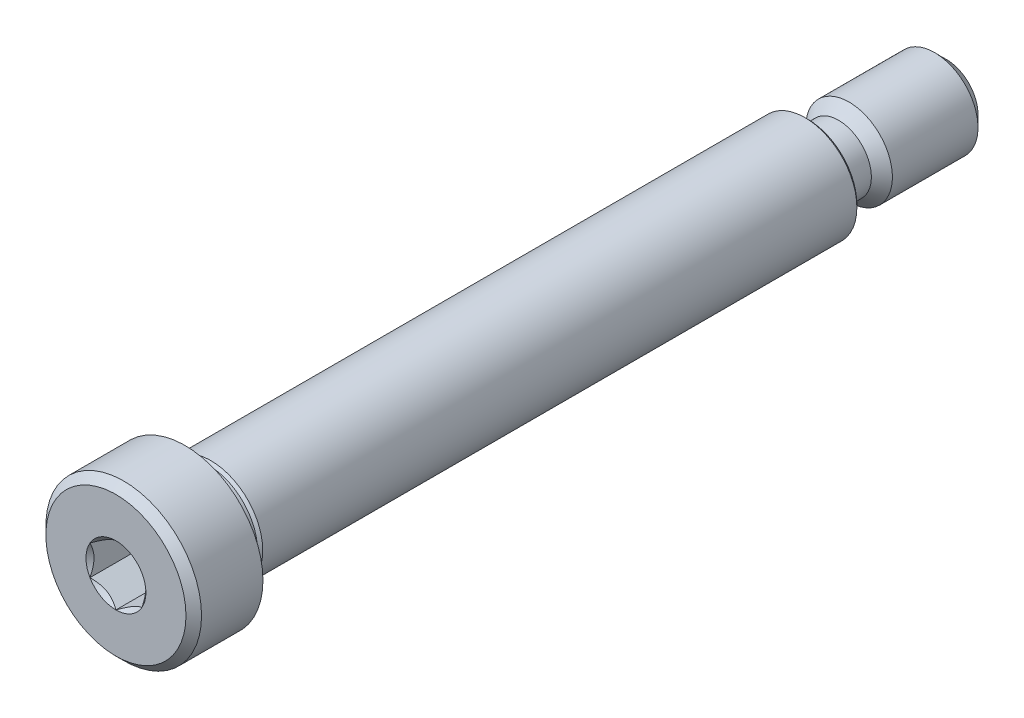
ISO-10303-21;
HEADER;
FILE_DESCRIPTION(('STEP AP214'),'2;1');
FILE_NAME('part.step','',(''),(''),'','','');
FILE_SCHEMA(('AUTOMOTIVE_DESIGN { 1 0 10303 214 1 1 1 1 }'));
ENDSEC;
DATA;
#1=APPLICATION_CONTEXT('core data for automotive mechanical design processes');
#2=APPLICATION_PROTOCOL_DEFINITION('international standard','automotive_design',2000,#1);
#3=PRODUCT_CONTEXT('',#1,'mechanical');
#4=PRODUCT('Part','Part','',(#3));
#5=PRODUCT_RELATED_PRODUCT_CATEGORY('part','',(#4));
#6=PRODUCT_DEFINITION_FORMATION('','',#4);
#7=PRODUCT_DEFINITION_CONTEXT('part definition',#1,'design');
#8=PRODUCT_DEFINITION('design','',#6,#7);
#9=PRODUCT_DEFINITION_SHAPE('','',#8);
#10=(LENGTH_UNIT() NAMED_UNIT(*) SI_UNIT(.MILLI.,.METRE.));
#11=(NAMED_UNIT(*) PLANE_ANGLE_UNIT() SI_UNIT($,.RADIAN.));
#12=(NAMED_UNIT(*) SI_UNIT($,.STERADIAN.) SOLID_ANGLE_UNIT());
#13=UNCERTAINTY_MEASURE_WITH_UNIT(LENGTH_MEASURE(1.E-05),#10,'distance_accuracy_value','');
#14=(GEOMETRIC_REPRESENTATION_CONTEXT(3) GLOBAL_UNCERTAINTY_ASSIGNED_CONTEXT((#13)) GLOBAL_UNIT_ASSIGNED_CONTEXT((#10,
#11,#12)) REPRESENTATION_CONTEXT('',''));
#15=CARTESIAN_POINT('',(0.,0.,0.));
#16=DIRECTION('',(0.,0.,1.));
#17=DIRECTION('',(1.,0.,0.));
#18=AXIS2_PLACEMENT_3D('',#15,#16,#17);
#19=CARTESIAN_POINT('',(0.,6.429375,38.1));
#20=DIRECTION('',(0.,0.,-1.));
#21=DIRECTION('',(-1.,0.,0.));
#22=AXIS2_PLACEMENT_3D('',#19,#20,#21);
#23=PLANE('',#22);
#24=CARTESIAN_POINT('',(0.,0.,38.1));
#25=DIRECTION('',(0.,0.,1.));
#26=DIRECTION('',(1.,0.,0.));
#27=AXIS2_PLACEMENT_3D('',#24,#25,#26);
#28=CIRCLE('',#27,2.74963065701559);
#29=CARTESIAN_POINT('',(-2.38125,1.3748153285078,38.1));
#30=VERTEX_POINT('',#29);
#31=CARTESIAN_POINT('',(-2.38125,-1.3748153285078,38.1));
#32=VERTEX_POINT('',#31);
#33=EDGE_CURVE('E135',#30,#32,#28,.T.);
#34=ORIENTED_EDGE('',*,*,#33,.F.);
#35=CARTESIAN_POINT('',(0.,2.74963065701559,38.1));
#36=VERTEX_POINT('',#35);
#37=EDGE_CURVE('E130',#36,#30,#28,.T.);
#38=ORIENTED_EDGE('',*,*,#37,.F.);
#39=CARTESIAN_POINT('',(2.38125,1.3748153285078,38.1));
#40=VERTEX_POINT('',#39);
#41=EDGE_CURVE('E102',#40,#36,#28,.T.);
#42=ORIENTED_EDGE('',*,*,#41,.F.);
#43=CARTESIAN_POINT('',(2.38125,-1.3748153285078,38.1));
#44=VERTEX_POINT('',#43);
#45=EDGE_CURVE('E92',#44,#40,#28,.T.);
#46=ORIENTED_EDGE('',*,*,#45,.F.);
#47=CARTESIAN_POINT('',(0.,-2.74963065701559,38.1));
#48=VERTEX_POINT('',#47);
#49=EDGE_CURVE('E53',#48,#44,#28,.T.);
#50=ORIENTED_EDGE('',*,*,#49,.F.);
#51=EDGE_CURVE('E60',#32,#48,#28,.T.);
#52=ORIENTED_EDGE('',*,*,#51,.F.);
#53=EDGE_LOOP('',(#34,#38,#42,#46,#50,#52));
#54=FACE_BOUND('',#53,.T.);
#55=CARTESIAN_POINT('',(0.,0.,38.1));
#56=DIRECTION('',(0.,0.,1.));
#57=DIRECTION('',(1.,0.,0.));
#58=AXIS2_PLACEMENT_3D('',#55,#56,#57);
#59=CIRCLE('',#58,6.429375);
#60=CARTESIAN_POINT('',(6.429375,0.,38.1));
#61=VERTEX_POINT('',#60);
#62=EDGE_CURVE('E47',#61,#61,#59,.T.);
#63=ORIENTED_EDGE('',*,*,#62,.T.);
#64=EDGE_LOOP('',(#63));
#65=FACE_BOUND('',#64,.T.);
#66=ADVANCED_FACE('F39',(#54,#65),#23,.F.);
#67=CARTESIAN_POINT('',(0.,0.,37.385625));
#68=DIRECTION('',(0.,0.,-1.));
#69=DIRECTION('',(-1.,0.,0.));
#70=AXIS2_PLACEMENT_3D('',#67,#68,#69);
#71=CONICAL_SURFACE('',#70,7.14375,0.785398163397442);
#72=ORIENTED_EDGE('',*,*,#62,.F.);
#73=EDGE_LOOP('',(#72));
#74=FACE_BOUND('',#73,.T.);
#75=CARTESIAN_POINT('',(0.,0.,37.385625));
#76=DIRECTION('',(0.,0.,1.));
#77=DIRECTION('',(1.,0.,0.));
#78=AXIS2_PLACEMENT_3D('',#75,#76,#77);
#79=CIRCLE('',#78,7.14375);
#80=CARTESIAN_POINT('',(7.14375,0.,37.385625));
#81=VERTEX_POINT('',#80);
#82=EDGE_CURVE('E304',#81,#81,#79,.T.);
#83=ORIENTED_EDGE('',*,*,#82,.T.);
#84=EDGE_LOOP('',(#83));
#85=FACE_BOUND('',#84,.T.);
#86=ADVANCED_FACE('F207',(#74,#85),#71,.T.);
#87=CARTESIAN_POINT('',(0.,0.,38.1));
#88=DIRECTION('',(0.,0.,1.));
#89=DIRECTION('',(1.,0.,0.));
#90=AXIS2_PLACEMENT_3D('',#87,#88,#89);
#91=CYLINDRICAL_SURFACE('',#90,7.14375);
#92=ORIENTED_EDGE('',*,*,#82,.F.);
#93=EDGE_LOOP('',(#92));
#94=FACE_BOUND('',#93,.T.);
#95=CARTESIAN_POINT('',(0.,0.,31.75));
#96=DIRECTION('',(0.,0.,1.));
#97=DIRECTION('',(1.,0.,0.));
#98=AXIS2_PLACEMENT_3D('',#95,#96,#97);
#99=CIRCLE('',#98,7.14375);
#100=CARTESIAN_POINT('',(7.14375,0.,31.75));
#101=VERTEX_POINT('',#100);
#102=EDGE_CURVE('E301',#101,#101,#99,.T.);
#103=ORIENTED_EDGE('',*,*,#102,.T.);
#104=EDGE_LOOP('',(#103));
#105=FACE_BOUND('',#104,.T.);
#106=ADVANCED_FACE('F211',(#94,#105),#91,.T.);
#107=CARTESIAN_POINT('',(0.,7.14375,31.75));
#108=DIRECTION('',(0.,0.,1.));
#109=DIRECTION('',(1.,0.,0.));
#110=AXIS2_PLACEMENT_3D('',#107,#108,#109);
#111=PLANE('',#110);
#112=ORIENTED_EDGE('',*,*,#102,.F.);
#113=EDGE_LOOP('',(#112));
#114=FACE_BOUND('',#113,.T.);
#115=CARTESIAN_POINT('',(0.,0.,31.75));
#116=DIRECTION('',(0.,0.,1.));
#117=DIRECTION('',(1.,0.,0.));
#118=AXIS2_PLACEMENT_3D('',#115,#116,#117);
#119=CIRCLE('',#118,4.7625);
#120=CARTESIAN_POINT('',(4.7625,0.,31.75));
#121=VERTEX_POINT('',#120);
#122=EDGE_CURVE('E298',#121,#121,#119,.T.);
#123=ORIENTED_EDGE('',*,*,#122,.T.);
#124=EDGE_LOOP('',(#123));
#125=FACE_BOUND('',#124,.T.);
#126=ADVANCED_FACE('F216',(#114,#125),#111,.F.);
#127=CARTESIAN_POINT('',(0.,0.,31.511875));
#128=DIRECTION('',(0.,0.,1.));
#129=DIRECTION('',(1.,0.,0.));
#130=AXIS2_PLACEMENT_3D('',#127,#128,#129);
#131=CONICAL_SURFACE('',#130,4.524375,0.785398163397452);
#132=ORIENTED_EDGE('',*,*,#122,.F.);
#133=EDGE_LOOP('',(#132));
#134=FACE_BOUND('',#133,.T.);
#135=CARTESIAN_POINT('',(0.,0.,31.511875));
#136=DIRECTION('',(0.,0.,1.));
#137=DIRECTION('',(1.,0.,0.));
#138=AXIS2_PLACEMENT_3D('',#135,#136,#137);
#139=CIRCLE('',#138,4.524375);
#140=CARTESIAN_POINT('',(4.524375,0.,31.511875));
#141=VERTEX_POINT('',#140);
#142=EDGE_CURVE('E295',#141,#141,#139,.T.);
#143=ORIENTED_EDGE('',*,*,#142,.T.);
#144=EDGE_LOOP('',(#143));
#145=FACE_BOUND('',#144,.T.);
#146=ADVANCED_FACE('F224',(#134,#145),#131,.T.);
#147=CARTESIAN_POINT('',(0.,0.,38.1));
#148=DIRECTION('',(0.,0.,1.));
#149=DIRECTION('',(1.,0.,0.));
#150=AXIS2_PLACEMENT_3D('',#147,#148,#149);
#151=CYLINDRICAL_SURFACE('',#150,4.524375);
#152=ORIENTED_EDGE('',*,*,#142,.F.);
#153=EDGE_LOOP('',(#152));
#154=FACE_BOUND('',#153,.T.);
#155=CARTESIAN_POINT('',(0.,0.,29.625925));
#156=DIRECTION('',(0.,0.,1.));
#157=DIRECTION('',(1.,0.,0.));
#158=AXIS2_PLACEMENT_3D('',#155,#156,#157);
#159=CIRCLE('',#158,4.524375);
#160=CARTESIAN_POINT('',(4.524375,0.,29.625925));
#161=VERTEX_POINT('',#160);
#162=EDGE_CURVE('E292',#161,#161,#159,.T.);
#163=ORIENTED_EDGE('',*,*,#162,.T.);
#164=EDGE_LOOP('',(#163));
#165=FACE_BOUND('',#164,.T.);
#166=ADVANCED_FACE('F228',(#154,#165),#151,.T.);
#167=CARTESIAN_POINT('',(0.,0.,29.3878));
#168=DIRECTION('',(0.,0.,-1.));
#169=DIRECTION('',(-1.,0.,0.));
#170=AXIS2_PLACEMENT_3D('',#167,#168,#169);
#171=CONICAL_SURFACE('',#170,4.7625,0.785398163397468);
#172=ORIENTED_EDGE('',*,*,#162,.F.);
#173=EDGE_LOOP('',(#172));
#174=FACE_BOUND('',#173,.T.);
#175=CARTESIAN_POINT('',(0.,0.,29.3878));
#176=DIRECTION('',(0.,0.,1.));
#177=DIRECTION('',(1.,0.,0.));
#178=AXIS2_PLACEMENT_3D('',#175,#176,#177);
#179=CIRCLE('',#178,4.7625);
#180=CARTESIAN_POINT('',(4.7625,0.,29.3878));
#181=VERTEX_POINT('',#180);
#182=EDGE_CURVE('E289',#181,#181,#179,.T.);
#183=ORIENTED_EDGE('',*,*,#182,.T.);
#184=EDGE_LOOP('',(#183));
#185=FACE_BOUND('',#184,.T.);
#186=ADVANCED_FACE('F232',(#174,#185),#171,.T.);
#187=CARTESIAN_POINT('',(0.,0.,38.1));
#188=DIRECTION('',(0.,0.,1.));
#189=DIRECTION('',(1.,0.,0.));
#190=AXIS2_PLACEMENT_3D('',#187,#188,#189);
#191=CYLINDRICAL_SURFACE('',#190,4.7625);
#192=ORIENTED_EDGE('',*,*,#182,.F.);
#193=EDGE_LOOP('',(#192));
#194=FACE_BOUND('',#193,.T.);
#195=CARTESIAN_POINT('',(0.,0.,-25.1375333333333));
#196=DIRECTION('',(0.,0.,1.));
#197=DIRECTION('',(1.,0.,0.));
#198=AXIS2_PLACEMENT_3D('',#195,#196,#197);
#199=CIRCLE('',#198,4.7625);
#200=CARTESIAN_POINT('',(4.7625,0.,-25.1375333333333));
#201=VERTEX_POINT('',#200);
#202=EDGE_CURVE('E286',#201,#201,#199,.T.);
#203=ORIENTED_EDGE('',*,*,#202,.T.);
#204=EDGE_LOOP('',(#203));
#205=FACE_BOUND('',#204,.T.);
#206=ADVANCED_FACE('F236',(#194,#205),#191,.T.);
#207=CARTESIAN_POINT('',(0.,0.,-25.4));
#208=DIRECTION('',(0.,0.,1.));
#209=DIRECTION('',(1.,0.,0.));
#210=AXIS2_PLACEMENT_3D('',#207,#208,#209);
#211=CONICAL_SURFACE('',#210,4.50003333333333,0.785398163397468);
#212=ORIENTED_EDGE('',*,*,#202,.F.);
#213=EDGE_LOOP('',(#212));
#214=FACE_BOUND('',#213,.T.);
#215=CARTESIAN_POINT('',(0.,0.,-25.4));
#216=DIRECTION('',(0.,0.,1.));
#217=DIRECTION('',(1.,0.,0.));
#218=AXIS2_PLACEMENT_3D('',#215,#216,#217);
#219=CIRCLE('',#218,4.50003333333333);
#220=CARTESIAN_POINT('',(4.50003333333333,0.,-25.4));
#221=VERTEX_POINT('',#220);
#222=EDGE_CURVE('E274',#221,#221,#219,.T.);
#223=ORIENTED_EDGE('',*,*,#222,.T.);
#224=EDGE_LOOP('',(#223));
#225=FACE_BOUND('',#224,.T.);
#226=ADVANCED_FACE('F240',(#214,#225),#211,.T.);
#227=CARTESIAN_POINT('',(0.,4.50003333333333,-25.4));
#228=DIRECTION('',(0.,0.,1.));
#229=DIRECTION('',(1.,0.,0.));
#230=AXIS2_PLACEMENT_3D('',#227,#228,#229);
#231=PLANE('',#230);
#232=CARTESIAN_POINT('',(0.,0.,-25.4));
#233=DIRECTION('',(0.,0.,-1.));
#234=DIRECTION('',(-1.,0.,0.));
#235=AXIS2_PLACEMENT_3D('',#232,#233,#234);
#236=CIRCLE('',#235,3.9751);
#237=CARTESIAN_POINT('',(-3.9751,0.,-25.4));
#238=VERTEX_POINT('',#237);
#239=EDGE_CURVE('E588',#238,#238,#236,.T.);
#240=ORIENTED_EDGE('',*,*,#239,.F.);
#241=EDGE_LOOP('',(#240));
#242=FACE_BOUND('',#241,.T.);
#243=ORIENTED_EDGE('',*,*,#222,.F.);
#244=EDGE_LOOP('',(#243));
#245=FACE_BOUND('',#244,.T.);
#246=ADVANCED_FACE('F244',(#242,#245),#231,.F.);
#247=CARTESIAN_POINT('',(0.,0.,38.1));
#248=DIRECTION('',(0.,0.,1.));
#249=DIRECTION('',(1.,0.,0.));
#250=AXIS2_PLACEMENT_3D('',#247,#248,#249);
#251=CONICAL_SURFACE('',#250,2.74963065701559,0.78539816339745);
#252=ORIENTED_EDGE('',*,*,#41,.T.);
#253=CARTESIAN_POINT('',(2.38145,1.37469985845396,38.1001154773272));
#254=CARTESIAN_POINT('',(2.29959321762095,1.4219598937955,38.0528948967095));
#255=CARTESIAN_POINT('',(2.21636766622824,1.47001018829554,38.0084475752929));
#256=CARTESIAN_POINT('',(2.04666151916196,1.56799007798739,37.9270654569856));
#257=CARTESIAN_POINT('',(1.9601647826469,1.61792899209838,37.8901759430951));
#258=CARTESIAN_POINT('',(1.78574822599096,1.71862843803482,37.8269834131659));
#259=CARTESIAN_POINT('',(1.69787282881932,1.76936332224701,37.8005215587295));
#260=CARTESIAN_POINT('',(1.52018740592912,1.87195004898374,37.7597515156161));
#261=CARTESIAN_POINT('',(1.43038280881413,1.92379875730254,37.7454128915305));
#262=CARTESIAN_POINT('',(1.27561039686966,2.01315665100181,37.7324757847701));
#263=CARTESIAN_POINT('',(1.21084255103038,2.05055038423195,37.7305606046532));
#264=CARTESIAN_POINT('',(1.08141272066443,2.1252767316349,37.7337866227677));
#265=CARTESIAN_POINT('',(1.01675078120664,2.16260931978718,37.7389302948571));
#266=CARTESIAN_POINT('',(0.888037451422602,2.23692199538629,37.7559813108716));
#267=CARTESIAN_POINT('',(0.823986825765144,2.27390164135138,37.7678962213493));
#268=CARTESIAN_POINT('',(0.696993161094725,2.34722146783423,37.797835672352));
#269=CARTESIAN_POINT('',(0.634050037564174,2.38356169714823,37.8158597445185));
#270=CARTESIAN_POINT('',(0.472823849267818,2.47664568036154,37.8693688075524));
#271=CARTESIAN_POINT('',(0.37554050871216,2.53281224321902,37.9088874208722));
#272=CARTESIAN_POINT('',(0.232493937374431,2.61540021968751,37.9756003435508));
#273=CARTESIAN_POINT('',(0.185353711056037,2.6426166420421,37.9990402091113));
#274=CARTESIAN_POINT('',(0.0919464736333635,2.69654533571233,38.0480566766595));
#275=CARTESIAN_POINT('',(0.0456789475031803,2.72325790437833,38.0736319667669));
#276=CARTESIAN_POINT('',(-0.000199999999998552,2.74974612706943,38.1001154773272));
#277=B_SPLINE_CURVE_WITH_KNOTS('',3,(#253,#254,#255,#256,#257,#258,#259,#260,#261,#262,#263,
#264,#265,#266,#267,#268,#269,#270,#271,#272,#273,#274,#275,#276),.UNSPECIFIED.,.F.,.F.,(4,2,2,
2,2,2,2,2,2,2,2,4),(0.,0.317196610611948,0.636241461041219,0.950218950629221,1.26340583824126,
1.48752413747844,1.71172100167747,1.93616888974082,2.16059957440836,2.51709639744763,
2.69486147369099,2.87251813383153),.UNSPECIFIED.);
#278=EDGE_CURVE('E11',#40,#36,#277,.T.);
#279=ORIENTED_EDGE('',*,*,#278,.F.);
#280=EDGE_LOOP('',(#252,#279));
#281=FACE_BOUND('',#280,.T.);
#282=ADVANCED_FACE('F105',(#281),#251,.F.);
#283=ORIENTED_EDGE('',*,*,#37,.T.);
#284=CARTESIAN_POINT('',(0.000199999999999747,2.74974612706943,38.1001154773272));
#285=CARTESIAN_POINT('',(-0.0816567823790499,2.70248609172789,38.0528948967095));
#286=CARTESIAN_POINT('',(-0.16488233377176,2.65443579722785,38.0084475752929));
#287=CARTESIAN_POINT('',(-0.33458848083804,2.556455907536,37.9270654569856));
#288=CARTESIAN_POINT('',(-0.421085217353103,2.50651699342501,37.8901759430951));
#289=CARTESIAN_POINT('',(-0.595501774009043,2.40581754748857,37.8269834131659));
#290=CARTESIAN_POINT('',(-0.683377171180674,2.35508266327639,37.8005215587295));
#291=CARTESIAN_POINT('',(-0.861062594070874,2.25249593653966,37.7597515156161));
#292=CARTESIAN_POINT('',(-0.950867191185869,2.20064722822085,37.7454128915305));
#293=CARTESIAN_POINT('',(-1.10563960313034,2.11128933452158,37.7324757847701));
#294=CARTESIAN_POINT('',(-1.17040744896962,2.07389560129144,37.7305606046532));
#295=CARTESIAN_POINT('',(-1.29983727933557,1.99916925388849,37.7337866227677));
#296=CARTESIAN_POINT('',(-1.36449921879335,1.96183666573622,37.7389302948571));
#297=CARTESIAN_POINT('',(-1.49321254857739,1.88752399013711,37.7559813108716));
#298=CARTESIAN_POINT('',(-1.55726317423485,1.85054434417201,37.7678962213493));
#299=CARTESIAN_POINT('',(-1.68425683890527,1.77722451768917,37.797835672352));
#300=CARTESIAN_POINT('',(-1.74719996243582,1.74088428837517,37.8158597445185));
#301=CARTESIAN_POINT('',(-1.90842615073218,1.64780030516185,37.8693688075524));
#302=CARTESIAN_POINT('',(-2.00570949128784,1.59163374230437,37.9088874208722));
#303=CARTESIAN_POINT('',(-2.14875606262557,1.50904576583588,37.9756003435508));
#304=CARTESIAN_POINT('',(-2.19589628894397,1.4818293434813,37.9990402091113));
#305=CARTESIAN_POINT('',(-2.28930352636664,1.42790064981106,38.0480566766595));
#306=CARTESIAN_POINT('',(-2.33557105249682,1.40118808114506,38.0736319667669));
#307=CARTESIAN_POINT('',(-2.38145,1.37469985845396,38.1001154773272));
#308=B_SPLINE_CURVE_WITH_KNOTS('',3,(#284,#285,#286,#287,#288,#289,#290,#291,#292,#293,#294,
#295,#296,#297,#298,#299,#300,#301,#302,#303,#304,#305,#306,#307),.UNSPECIFIED.,.F.,.F.,(4,2,2,
2,2,2,2,2,2,2,2,4),(0.,0.317196610611948,0.636241461041218,0.95021895062922,1.26340583824126,
1.48752413747844,1.71172100167747,1.93616888974082,2.16059957440836,2.51709639744763,
2.69486147369099,2.87251813383154),.UNSPECIFIED.);
#309=EDGE_CURVE('E131',#36,#30,#308,.T.);
#310=ORIENTED_EDGE('',*,*,#309,.F.);
#311=EDGE_LOOP('',(#283,#310));
#312=FACE_BOUND('',#311,.T.);
#313=ADVANCED_FACE('F337',(#312),#251,.F.);
#314=ORIENTED_EDGE('',*,*,#33,.T.);
#315=CARTESIAN_POINT('',(-2.38125,-2.74194290589387,38.9819808945799));
#316=CARTESIAN_POINT('',(-2.38125,-2.67517961056039,38.9315846679781));
#317=CARTESIAN_POINT('',(-2.38125,-2.60804251112752,38.8816755875907));
#318=CARTESIAN_POINT('',(-2.38125,-2.47287325055307,38.7830498309857));
#319=CARTESIAN_POINT('',(-2.38125,-2.40484086895313,38.7343334572448));
#320=CARTESIAN_POINT('',(-2.38125,-2.26723593505441,38.6379648544535));
#321=CARTESIAN_POINT('',(-2.38125,-2.19765553346049,38.5903237954326));
#322=CARTESIAN_POINT('',(-2.38125,-2.05731367842203,38.4968199233866));
#323=CARTESIAN_POINT('',(-2.38125,-1.98655230892573,38.4509569847287));
#324=CARTESIAN_POINT('',(-2.38125,-1.83957751909226,38.3588459007133));
#325=CARTESIAN_POINT('',(-2.38125,-1.76328361992076,38.3127255173928));
#326=CARTESIAN_POINT('',(-2.38125,-1.6089135770446,38.2235183038905));
#327=CARTESIAN_POINT('',(-2.38125,-1.53083712149137,38.1804320099754));
#328=CARTESIAN_POINT('',(-2.38125,-1.37291620334514,38.0982265014712));
#329=CARTESIAN_POINT('',(-2.38125,-1.29307799938228,38.0590953578519));
#330=CARTESIAN_POINT('',(-2.38125,-1.13121425093133,37.9856679503152));
#331=CARTESIAN_POINT('',(-2.38125,-1.04918943681796,37.9513700954538));
#332=CARTESIAN_POINT('',(-2.38125,-0.889535256759272,37.8913546314156));
#333=CARTESIAN_POINT('',(-2.38125,-0.812083865770259,37.865168478432));
#334=CARTESIAN_POINT('',(-2.38125,-0.655316366527662,37.8190097514868));
#335=CARTESIAN_POINT('',(-2.38125,-0.576000130216831,37.7990376055837));
#336=CARTESIAN_POINT('',(-2.38125,-0.417295761573376,37.7666821452488));
#337=CARTESIAN_POINT('',(-2.38125,-0.337934576883848,37.7541688083547));
#338=CARTESIAN_POINT('',(-2.38125,-0.178363852969585,37.7369738601659));
#339=CARTESIAN_POINT('',(-2.38125,-0.0981544619617681,37.7322909026126));
#340=CARTESIAN_POINT('',(-2.38125,0.0594188034321283,37.7311044408392));
#341=CARTESIAN_POINT('',(-2.38125,0.136780588525992,37.7343110105046));
#342=CARTESIAN_POINT('',(-2.38125,0.290840960607338,37.7480870567428));
#343=CARTESIAN_POINT('',(-2.38125,0.367539482435408,37.7586572485871));
#344=CARTESIAN_POINT('',(-2.38125,0.521017492835388,37.7867628298525));
#345=CARTESIAN_POINT('',(-2.38125,0.597774958394049,37.8044167489315));
#346=CARTESIAN_POINT('',(-2.38125,0.74960981425701,37.8457513962434));
#347=CARTESIAN_POINT('',(-2.38125,0.824687344568027,37.8694316201904));
#348=CARTESIAN_POINT('',(-2.38125,1.06107814410025,37.952894862956));
#349=CARTESIAN_POINT('',(-2.38125,1.21904786221809,38.0221839270396));
#350=CARTESIAN_POINT('',(-2.38125,1.45021000267341,38.1376640838597));
#351=CARTESIAN_POINT('',(-2.38125,1.52644290442584,38.1781730572583));
#352=CARTESIAN_POINT('',(-2.38125,1.67717618538172,38.2623026892371));
#353=CARTESIAN_POINT('',(-2.38125,1.75167687358839,38.3059227870999));
#354=CARTESIAN_POINT('',(-2.38125,1.89548152088327,38.393412556489));
#355=CARTESIAN_POINT('',(-2.38125,1.96485959608998,38.4371617927418));
#356=CARTESIAN_POINT('',(-2.38125,2.10242624411169,38.5265011587306));
#357=CARTESIAN_POINT('',(-2.38125,2.17061472626633,38.572091427904));
#358=CARTESIAN_POINT('',(-2.38125,2.30540317317354,38.6644060050932));
#359=CARTESIAN_POINT('',(-2.38125,2.37201154222166,38.7111180928962));
#360=CARTESIAN_POINT('',(-2.38125,2.50431800054459,38.8057775780183));
#361=CARTESIAN_POINT('',(-2.38125,2.57001633510792,38.8537246320963));
#362=CARTESIAN_POINT('',(-2.38125,2.63533378855947,38.9021767335425));
#363=B_SPLINE_CURVE_WITH_KNOTS('',3,(#315,#316,#317,#318,#319,#320,#321,#322,#323,#324,#325,
#326,#327,#328,#329,#330,#331,#332,#333,#334,#335,#336,#337,#338,#339,#340,#341,#342,#343,#344,
#345,#346,#347,#348,#349,#350,#351,#352,#353,#354,#355,#356,#357,#358,#359,#360,#361,#362),
.UNSPECIFIED.,.F.,.F.,(4,2,2,2,2,2,2,2,2,2,2,2,2,2,2,2,2,2,2,2,2,2,2,4),(0.,0.250951284009984,
0.501965564827882,0.754924775973584,1.00786608164542,1.27526207798892,1.54270521780082,
1.80931602029339,2.07583885812519,2.32089852590464,2.56597507114536,2.80664400307698,
3.04727155311265,3.27918940971451,3.51112979698762,3.74712477407483,3.98310000940112,
4.49898139184704,4.75794323931353,5.01685853149448,5.2628896001536,5.50893933794672,
5.75299038397141,5.9969743162797),.UNSPECIFIED.);
#364=EDGE_CURVE('E133',#30,#32,#363,.F.);
#365=ORIENTED_EDGE('',*,*,#364,.F.);
#366=EDGE_LOOP('',(#314,#365));
#367=FACE_BOUND('',#366,.T.);
#368=ADVANCED_FACE('F330',(#367),#251,.F.);
#369=ORIENTED_EDGE('',*,*,#51,.T.);
#370=CARTESIAN_POINT('',(-2.38145,-1.37469985845396,38.1001154773272));
#371=CARTESIAN_POINT('',(-2.29959321762095,-1.4219598937955,38.0528948967095));
#372=CARTESIAN_POINT('',(-2.21636766622824,-1.47001018829554,38.0084475752929));
#373=CARTESIAN_POINT('',(-2.04666151916196,-1.56799007798739,37.9270654569856));
#374=CARTESIAN_POINT('',(-1.9601647826469,-1.61792899209838,37.8901759430951));
#375=CARTESIAN_POINT('',(-1.78574822599096,-1.71862843803482,37.8269834131659));
#376=CARTESIAN_POINT('',(-1.69787282881933,-1.769363322247,37.8005215587295));
#377=CARTESIAN_POINT('',(-1.52018740592913,-1.87195004898373,37.7597515156161));
#378=CARTESIAN_POINT('',(-1.43038280881413,-1.92379875730254,37.7454128915305));
#379=CARTESIAN_POINT('',(-1.27561039686966,-2.01315665100181,37.7324757847701));
#380=CARTESIAN_POINT('',(-1.21084255103038,-2.05055038423195,37.7305606046532));
#381=CARTESIAN_POINT('',(-1.08141272066443,-2.1252767316349,37.7337866227677));
#382=CARTESIAN_POINT('',(-1.01675078120665,-2.16260931978717,37.7389302948571));
#383=CARTESIAN_POINT('',(-0.888037451422605,-2.23692199538628,37.7559813108716));
#384=CARTESIAN_POINT('',(-0.823986825765148,-2.27390164135138,37.7678962213493));
#385=CARTESIAN_POINT('',(-0.696993161094729,-2.34722146783422,37.797835672352));
#386=CARTESIAN_POINT('',(-0.634050037564179,-2.38356169714822,37.8158597445185));
#387=CARTESIAN_POINT('',(-0.472823849267822,-2.47664568036154,37.8693688075524));
#388=CARTESIAN_POINT('',(-0.375540508712165,-2.53281224321902,37.9088874208722));
#389=CARTESIAN_POINT('',(-0.232493937374433,-2.61540021968751,37.9756003435508));
#390=CARTESIAN_POINT('',(-0.185353711056038,-2.64261664204209,37.9990402091113));
#391=CARTESIAN_POINT('',(-0.0919464736333616,-2.69654533571233,38.0480566766595));
#392=CARTESIAN_POINT('',(-0.0456789475031772,-2.72325790437834,38.0736319667669));
#393=CARTESIAN_POINT('',(0.00020000000000081,-2.74974612706943,38.1001154773272));
#394=B_SPLINE_CURVE_WITH_KNOTS('',3,(#370,#371,#372,#373,#374,#375,#376,#377,#378,#379,#380,
#381,#382,#383,#384,#385,#386,#387,#388,#389,#390,#391,#392,#393),.UNSPECIFIED.,.F.,.F.,(4,2,2,
2,2,2,2,2,2,2,2,4),(0.,0.317196610611948,0.636241461041217,0.950218950629219,1.26340583824126,
1.48752413747844,1.71172100167747,1.93616888974082,2.16059957440836,2.51709639744762,
2.69486147369098,2.87251813383154),.UNSPECIFIED.);
#395=EDGE_CURVE('E173',#32,#48,#394,.T.);
#396=ORIENTED_EDGE('',*,*,#395,.F.);
#397=EDGE_LOOP('',(#369,#396));
#398=FACE_BOUND('',#397,.T.);
#399=ADVANCED_FACE('F331',(#398),#251,.F.);
#400=ORIENTED_EDGE('',*,*,#49,.T.);
#401=CARTESIAN_POINT('',(-0.000200000000000139,-2.74974612706943,38.1001154773272));
#402=CARTESIAN_POINT('',(0.0816567823790499,-2.70248609172789,38.0528948967095));
#403=CARTESIAN_POINT('',(0.16488233377176,-2.65443579722785,38.0084475752929));
#404=CARTESIAN_POINT('',(0.334588480838041,-2.556455907536,37.9270654569856));
#405=CARTESIAN_POINT('',(0.421085217353104,-2.50651699342501,37.8901759430951));
#406=CARTESIAN_POINT('',(0.595501774009045,-2.40581754748857,37.8269834131659));
#407=CARTESIAN_POINT('',(0.683377171180677,-2.35508266327638,37.8005215587295));
#408=CARTESIAN_POINT('',(0.861062594070879,-2.25249593653965,37.7597515156161));
#409=CARTESIAN_POINT('',(0.950867191185875,-2.20064722822084,37.7454128915305));
#410=CARTESIAN_POINT('',(1.10563960313034,-2.11128933452158,37.7324757847701));
#411=CARTESIAN_POINT('',(1.17040744896962,-2.07389560129144,37.7305606046532));
#412=CARTESIAN_POINT('',(1.29983727933558,-1.99916925388849,37.7337866227677));
#413=CARTESIAN_POINT('',(1.36449921879336,-1.96183666573621,37.7389302948571));
#414=CARTESIAN_POINT('',(1.4932125485774,-1.8875239901371,37.7559813108716));
#415=CARTESIAN_POINT('',(1.55726317423486,-1.85054434417201,37.7678962213493));
#416=CARTESIAN_POINT('',(1.68425683890528,-1.77722451768916,37.797835672352));
#417=CARTESIAN_POINT('',(1.74719996243583,-1.74088428837516,37.8158597445185));
#418=CARTESIAN_POINT('',(1.90842615073219,-1.64780030516185,37.8693688075524));
#419=CARTESIAN_POINT('',(2.00570949128784,-1.59163374230437,37.9088874208722));
#420=CARTESIAN_POINT('',(2.14875606262557,-1.50904576583588,37.9756003435508));
#421=CARTESIAN_POINT('',(2.19589628894397,-1.4818293434813,37.9990402091113));
#422=CARTESIAN_POINT('',(2.28930352636664,-1.42790064981106,38.0480566766595));
#423=CARTESIAN_POINT('',(2.33557105249682,-1.40118808114506,38.0736319667669));
#424=CARTESIAN_POINT('',(2.38145,-1.37469985845396,38.1001154773272));
#425=B_SPLINE_CURVE_WITH_KNOTS('',3,(#401,#402,#403,#404,#405,#406,#407,#408,#409,#410,#411,
#412,#413,#414,#415,#416,#417,#418,#419,#420,#421,#422,#423,#424),.UNSPECIFIED.,.F.,.F.,(4,2,2,
2,2,2,2,2,2,2,2,4),(0.,0.317196610611949,0.63624146104122,0.950218950629224,1.26340583824126,
1.48752413747844,1.71172100167747,1.93616888974082,2.16059957440837,2.51709639744763,
2.69486147369099,2.87251813383154),.UNSPECIFIED.);
#426=EDGE_CURVE('E117',#48,#44,#425,.T.);
#427=ORIENTED_EDGE('',*,*,#426,.F.);
#428=EDGE_LOOP('',(#400,#427));
#429=FACE_BOUND('',#428,.T.);
#430=ADVANCED_FACE('F159',(#429),#251,.F.);
#431=ORIENTED_EDGE('',*,*,#45,.T.);
#432=CARTESIAN_POINT('',(2.38125,-2.74194290589387,38.9819808945799));
#433=CARTESIAN_POINT('',(2.38125,-2.6751796105604,38.9315846679781));
#434=CARTESIAN_POINT('',(2.38125,-2.60804251112753,38.8816755875907));
#435=CARTESIAN_POINT('',(2.38125,-2.47287325055308,38.7830498309857));
#436=CARTESIAN_POINT('',(2.38125,-2.40484086895313,38.7343334572448));
#437=CARTESIAN_POINT('',(2.38125,-2.26723593505442,38.6379648544535));
#438=CARTESIAN_POINT('',(2.38125,-2.1976555334605,38.5903237954326));
#439=CARTESIAN_POINT('',(2.38125,-2.05731367842204,38.4968199233866));
#440=CARTESIAN_POINT('',(2.38125,-1.98655230892574,38.4509569847287));
#441=CARTESIAN_POINT('',(2.38125,-1.83957751909226,38.3588459007133));
#442=CARTESIAN_POINT('',(2.38125,-1.76328361992076,38.3127255173928));
#443=CARTESIAN_POINT('',(2.38125,-1.6089135770446,38.2235183038905));
#444=CARTESIAN_POINT('',(2.38125,-1.53083712149137,38.1804320099754));
#445=CARTESIAN_POINT('',(2.38125,-1.37291620334514,38.0982265014712));
#446=CARTESIAN_POINT('',(2.38125,-1.29307799938228,38.0590953578519));
#447=CARTESIAN_POINT('',(2.38125,-1.13121425093133,37.9856679503152));
#448=CARTESIAN_POINT('',(2.38125,-1.04918943681796,37.9513700954538));
#449=CARTESIAN_POINT('',(2.38125,-0.889535256759276,37.8913546314156));
#450=CARTESIAN_POINT('',(2.38125,-0.812083865770264,37.865168478432));
#451=CARTESIAN_POINT('',(2.38125,-0.655316366527667,37.8190097514868));
#452=CARTESIAN_POINT('',(2.38125,-0.576000130216835,37.7990376055837));
#453=CARTESIAN_POINT('',(2.38125,-0.417295761573379,37.7666821452488));
#454=CARTESIAN_POINT('',(2.38125,-0.337934576883851,37.7541688083547));
#455=CARTESIAN_POINT('',(2.38125,-0.178363852969586,37.7369738601659));
#456=CARTESIAN_POINT('',(2.38125,-0.0981544619617697,37.7322909026126));
#457=CARTESIAN_POINT('',(2.38125,0.0594188034321266,37.7311044408392));
#458=CARTESIAN_POINT('',(2.38125,0.13678058852599,37.7343110105046));
#459=CARTESIAN_POINT('',(2.38125,0.290840960607336,37.7480870567428));
#460=CARTESIAN_POINT('',(2.38125,0.367539482435406,37.7586572485871));
#461=CARTESIAN_POINT('',(2.38125,0.521017492835386,37.7867628298525));
#462=CARTESIAN_POINT('',(2.38125,0.597774958394048,37.8044167489315));
#463=CARTESIAN_POINT('',(2.38125,0.74960981425701,37.8457513962434));
#464=CARTESIAN_POINT('',(2.38125,0.824687344568027,37.8694316201904));
#465=CARTESIAN_POINT('',(2.38125,1.06107814410025,37.952894862956));
#466=CARTESIAN_POINT('',(2.38125,1.2190478622181,38.0221839270396));
#467=CARTESIAN_POINT('',(2.38125,1.45021000267341,38.1376640838597));
#468=CARTESIAN_POINT('',(2.38125,1.52644290442584,38.1781730572583));
#469=CARTESIAN_POINT('',(2.38125,1.67717618538172,38.2623026892371));
#470=CARTESIAN_POINT('',(2.38125,1.75167687358839,38.3059227870999));
#471=CARTESIAN_POINT('',(2.38125,1.89548152088327,38.393412556489));
#472=CARTESIAN_POINT('',(2.38125,1.96485959608998,38.4371617927418));
#473=CARTESIAN_POINT('',(2.38125,2.10242624411169,38.5265011587306));
#474=CARTESIAN_POINT('',(2.38125,2.17061472626633,38.572091427904));
#475=CARTESIAN_POINT('',(2.38125,2.30540317317354,38.6644060050932));
#476=CARTESIAN_POINT('',(2.38125,2.37201154222166,38.7111180928962));
#477=CARTESIAN_POINT('',(2.38125,2.50431800054459,38.8057775780183));
#478=CARTESIAN_POINT('',(2.38125,2.57001633510792,38.8537246320963));
#479=CARTESIAN_POINT('',(2.38125,2.63533378855947,38.9021767335425));
#480=B_SPLINE_CURVE_WITH_KNOTS('',3,(#432,#433,#434,#435,#436,#437,#438,#439,#440,#441,#442,
#443,#444,#445,#446,#447,#448,#449,#450,#451,#452,#453,#454,#455,#456,#457,#458,#459,#460,#461,
#462,#463,#464,#465,#466,#467,#468,#469,#470,#471,#472,#473,#474,#475,#476,#477,#478,#479),
.UNSPECIFIED.,.F.,.F.,(4,2,2,2,2,2,2,2,2,2,2,2,2,2,2,2,2,2,2,2,2,2,2,4),(0.,0.250951284009986,
0.501965564827887,0.754924775973589,1.00786608164542,1.27526207798892,1.54270521780083,
1.80931602029339,2.07583885812519,2.32089852590464,2.56597507114536,2.80664400307699,
3.04727155311265,3.27918940971451,3.51112979698762,3.74712477407483,3.98310000940113,
4.49898139184705,4.75794323931355,5.01685853149448,5.26288960015361,5.50893933794673,
5.75299038397142,5.99697431627971),.UNSPECIFIED.);
#481=EDGE_CURVE('E96',#44,#40,#480,.T.);
#482=ORIENTED_EDGE('',*,*,#481,.F.);
#483=EDGE_LOOP('',(#431,#482));
#484=FACE_BOUND('',#483,.T.);
#485=ADVANCED_FACE('F94',(#484),#251,.F.);
#486=CARTESIAN_POINT('',(0.,0.,33.3375));
#487=DIRECTION('',(0.,0.,1.));
#488=DIRECTION('',(1.,0.,0.));
#489=AXIS2_PLACEMENT_3D('',#486,#487,#488);
#490=PLANE('',#489);
#491=DIRECTION('',(0.,1.,0.));
#492=VECTOR('',#491,1.);
#493=CARTESIAN_POINT('',(2.38125,-1.3748153285078,33.3375));
#494=LINE('',#493,#492);
#495=CARTESIAN_POINT('',(2.38125,-1.3748153285078,33.3375));
#496=VERTEX_POINT('',#495);
#497=CARTESIAN_POINT('',(2.38125,1.3748153285078,33.3375));
#498=VERTEX_POINT('',#497);
#499=EDGE_CURVE('E116',#496,#498,#494,.T.);
#500=ORIENTED_EDGE('',*,*,#499,.T.);
#501=DIRECTION('',(-0.866025403784439,0.5,0.));
#502=VECTOR('',#501,1.);
#503=CARTESIAN_POINT('',(2.38125,1.3748153285078,33.3375));
#504=LINE('',#503,#502);
#505=CARTESIAN_POINT('',(0.,2.74963065701559,33.3375));
#506=VERTEX_POINT('',#505);
#507=EDGE_CURVE('E121',#498,#506,#504,.T.);
#508=ORIENTED_EDGE('',*,*,#507,.T.);
#509=DIRECTION('',(-0.866025403784439,-0.5,0.));
#510=VECTOR('',#509,1.);
#511=CARTESIAN_POINT('',(0.,2.74963065701559,33.3375));
#512=LINE('',#511,#510);
#513=CARTESIAN_POINT('',(-2.38125,1.3748153285078,33.3375));
#514=VERTEX_POINT('',#513);
#515=EDGE_CURVE('E263',#506,#514,#512,.T.);
#516=ORIENTED_EDGE('',*,*,#515,.T.);
#517=DIRECTION('',(0.,-1.,0.));
#518=VECTOR('',#517,1.);
#519=CARTESIAN_POINT('',(-2.38125,1.3748153285078,33.3375));
#520=LINE('',#519,#518);
#521=CARTESIAN_POINT('',(-2.38125,-1.3748153285078,33.3375));
#522=VERTEX_POINT('',#521);
#523=EDGE_CURVE('E267',#514,#522,#520,.T.);
#524=ORIENTED_EDGE('',*,*,#523,.T.);
#525=DIRECTION('',(0.866025403784439,-0.5,0.));
#526=VECTOR('',#525,1.);
#527=CARTESIAN_POINT('',(-2.38125,-1.3748153285078,33.3375));
#528=LINE('',#527,#526);
#529=CARTESIAN_POINT('',(0.,-2.74963065701559,33.3375));
#530=VERTEX_POINT('',#529);
#531=EDGE_CURVE('E270',#522,#530,#528,.T.);
#532=ORIENTED_EDGE('',*,*,#531,.T.);
#533=DIRECTION('',(0.866025403784439,0.5,0.));
#534=VECTOR('',#533,1.);
#535=CARTESIAN_POINT('',(0.,-2.74963065701559,33.3375));
#536=LINE('',#535,#534);
#537=EDGE_CURVE('E124',#530,#496,#536,.T.);
#538=ORIENTED_EDGE('',*,*,#537,.T.);
#539=EDGE_LOOP('',(#500,#508,#516,#524,#532,#538));
#540=FACE_BOUND('',#539,.T.);
#541=ADVANCED_FACE('F158',(#540),#490,.T.);
#542=CARTESIAN_POINT('',(2.38125,1.3748153285078,33.3375));
#543=DIRECTION('',(0.5,0.866025403784439,0.));
#544=DIRECTION('',(-0.866025403784439,0.5,0.));
#545=AXIS2_PLACEMENT_3D('',#542,#543,#544);
#546=PLANE('',#545);
#547=DIRECTION('',(0.,0.,1.));
#548=VECTOR('',#547,1.);
#549=CARTESIAN_POINT('',(2.38125,1.3748153285078,33.3375));
#550=LINE('',#549,#548);
#551=EDGE_CURVE('E113',#498,#40,#550,.T.);
#552=ORIENTED_EDGE('',*,*,#551,.T.);
#553=ORIENTED_EDGE('',*,*,#278,.T.);
#554=DIRECTION('',(0.,0.,1.));
#555=VECTOR('',#554,1.);
#556=CARTESIAN_POINT('',(0.,2.74963065701559,33.3375));
#557=LINE('',#556,#555);
#558=EDGE_CURVE('E123',#506,#36,#557,.T.);
#559=ORIENTED_EDGE('',*,*,#558,.F.);
#560=ORIENTED_EDGE('',*,*,#507,.F.);
#561=EDGE_LOOP('',(#552,#553,#559,#560));
#562=FACE_BOUND('',#561,.T.);
#563=ADVANCED_FACE('F119',(#562),#546,.F.);
#564=CARTESIAN_POINT('',(0.,2.74963065701559,33.3375));
#565=DIRECTION('',(-0.5,0.866025403784439,0.));
#566=DIRECTION('',(-0.866025403784439,-0.5,0.));
#567=AXIS2_PLACEMENT_3D('',#564,#565,#566);
#568=PLANE('',#567);
#569=ORIENTED_EDGE('',*,*,#558,.T.);
#570=ORIENTED_EDGE('',*,*,#309,.T.);
#571=DIRECTION('',(0.,0.,1.));
#572=VECTOR('',#571,1.);
#573=CARTESIAN_POINT('',(-2.38125,1.3748153285078,33.3375));
#574=LINE('',#573,#572);
#575=EDGE_CURVE('E281',#514,#30,#574,.T.);
#576=ORIENTED_EDGE('',*,*,#575,.F.);
#577=ORIENTED_EDGE('',*,*,#515,.F.);
#578=EDGE_LOOP('',(#569,#570,#576,#577));
#579=FACE_BOUND('',#578,.T.);
#580=ADVANCED_FACE('F151',(#579),#568,.F.);
#581=CARTESIAN_POINT('',(-2.38125,1.3748153285078,33.3375));
#582=DIRECTION('',(-1.,0.,0.));
#583=DIRECTION('',(0.,0.,1.));
#584=AXIS2_PLACEMENT_3D('',#581,#582,#583);
#585=PLANE('',#584);
#586=ORIENTED_EDGE('',*,*,#575,.T.);
#587=ORIENTED_EDGE('',*,*,#364,.T.);
#588=DIRECTION('',(0.,0.,1.));
#589=VECTOR('',#588,1.);
#590=CARTESIAN_POINT('',(-2.38125,-1.3748153285078,33.3375));
#591=LINE('',#590,#589);
#592=EDGE_CURVE('E278',#522,#32,#591,.T.);
#593=ORIENTED_EDGE('',*,*,#592,.F.);
#594=ORIENTED_EDGE('',*,*,#523,.F.);
#595=EDGE_LOOP('',(#586,#587,#593,#594));
#596=FACE_BOUND('',#595,.T.);
#597=ADVANCED_FACE('F197',(#596),#585,.F.);
#598=CARTESIAN_POINT('',(-2.38125,-1.3748153285078,33.3375));
#599=DIRECTION('',(-0.5,-0.866025403784439,0.));
#600=DIRECTION('',(0.866025403784439,-0.5,0.));
#601=AXIS2_PLACEMENT_3D('',#598,#599,#600);
#602=PLANE('',#601);
#603=ORIENTED_EDGE('',*,*,#592,.T.);
#604=ORIENTED_EDGE('',*,*,#395,.T.);
#605=DIRECTION('',(0.,0.,1.));
#606=VECTOR('',#605,1.);
#607=CARTESIAN_POINT('',(0.,-2.74963065701559,33.3375));
#608=LINE('',#607,#606);
#609=EDGE_CURVE('E275',#530,#48,#608,.T.);
#610=ORIENTED_EDGE('',*,*,#609,.F.);
#611=ORIENTED_EDGE('',*,*,#531,.F.);
#612=EDGE_LOOP('',(#603,#604,#610,#611));
#613=FACE_BOUND('',#612,.T.);
#614=ADVANCED_FACE('F193',(#613),#602,.F.);
#615=CARTESIAN_POINT('',(0.,-2.74963065701559,33.3375));
#616=DIRECTION('',(0.5,-0.866025403784439,0.));
#617=DIRECTION('',(0.866025403784439,0.5,0.));
#618=AXIS2_PLACEMENT_3D('',#615,#616,#617);
#619=PLANE('',#618);
#620=ORIENTED_EDGE('',*,*,#609,.T.);
#621=ORIENTED_EDGE('',*,*,#426,.T.);
#622=DIRECTION('',(0.,0.,1.));
#623=VECTOR('',#622,1.);
#624=CARTESIAN_POINT('',(2.38125,-1.3748153285078,33.3375));
#625=LINE('',#624,#623);
#626=EDGE_CURVE('E115',#496,#44,#625,.T.);
#627=ORIENTED_EDGE('',*,*,#626,.F.);
#628=ORIENTED_EDGE('',*,*,#537,.F.);
#629=EDGE_LOOP('',(#620,#621,#627,#628));
#630=FACE_BOUND('',#629,.T.);
#631=ADVANCED_FACE('F190',(#630),#619,.F.);
#632=CARTESIAN_POINT('',(2.38125,-1.3748153285078,33.3375));
#633=DIRECTION('',(1.,0.,0.));
#634=DIRECTION('',(0.,1.,0.));
#635=AXIS2_PLACEMENT_3D('',#632,#633,#634);
#636=PLANE('',#635);
#637=ORIENTED_EDGE('',*,*,#626,.T.);
#638=ORIENTED_EDGE('',*,*,#481,.T.);
#639=ORIENTED_EDGE('',*,*,#551,.F.);
#640=ORIENTED_EDGE('',*,*,#499,.F.);
#641=EDGE_LOOP('',(#637,#638,#639,#640));
#642=FACE_BOUND('',#641,.T.);
#643=ADVANCED_FACE('F111',(#642),#636,.F.);
#644=CARTESIAN_POINT('',(0.,0.,-26.3652));
#645=DIRECTION('',(0.,0.,-1.));
#646=DIRECTION('',(-1.,0.,0.));
#647=AXIS2_PLACEMENT_3D('',#644,#645,#646);
#648=TOROIDAL_SURFACE('',#647,3.9751,0.965200000000001);
#649=CARTESIAN_POINT('',(0.,0.,-26.3652));
#650=DIRECTION('',(0.,0.,-1.));
#651=DIRECTION('',(-1.,0.,0.));
#652=AXIS2_PLACEMENT_3D('',#649,#650,#651);
#653=CIRCLE('',#652,3.0099);
#654=CARTESIAN_POINT('',(-3.0099,0.,-26.3652));
#655=VERTEX_POINT('',#654);
#656=EDGE_CURVE('E587',#655,#655,#653,.T.);
#657=ORIENTED_EDGE('',*,*,#656,.F.);
#658=EDGE_LOOP('',(#657));
#659=FACE_BOUND('',#658,.T.);
#660=ORIENTED_EDGE('',*,*,#239,.T.);
#661=EDGE_LOOP('',(#660));
#662=FACE_BOUND('',#661,.T.);
#663=ADVANCED_FACE('F250',(#659,#662),#648,.F.);
#664=CARTESIAN_POINT('',(0.,0.,-38.1));
#665=DIRECTION('',(0.,0.,-1.));
#666=DIRECTION('',(-1.,0.,0.));
#667=AXIS2_PLACEMENT_3D('',#664,#665,#666);
#668=CYLINDRICAL_SURFACE('',#667,3.0099);
#669=CARTESIAN_POINT('',(0.,0.,-28.2194));
#670=DIRECTION('',(0.,0.,-1.));
#671=DIRECTION('',(-1.,0.,0.));
#672=AXIS2_PLACEMENT_3D('',#669,#670,#671);
#673=CIRCLE('',#672,3.0099);
#674=CARTESIAN_POINT('',(-3.0099,0.,-28.2194));
#675=VERTEX_POINT('',#674);
#676=EDGE_CURVE('E586',#675,#675,#673,.T.);
#677=ORIENTED_EDGE('',*,*,#676,.F.);
#678=EDGE_LOOP('',(#677));
#679=FACE_BOUND('',#678,.T.);
#680=ORIENTED_EDGE('',*,*,#656,.T.);
#681=EDGE_LOOP('',(#680));
#682=FACE_BOUND('',#681,.T.);
#683=ADVANCED_FACE('F483',(#679,#682),#668,.T.);
#684=CARTESIAN_POINT('',(0.,0.,-28.2194));
#685=DIRECTION('',(0.,0.,-1.));
#686=DIRECTION('',(-1.,0.,0.));
#687=AXIS2_PLACEMENT_3D('',#684,#685,#686);
#688=CONICAL_SURFACE('',#687,3.0099,0.785398163397443);
#689=CARTESIAN_POINT('',(0.,0.,-29.1846));
#690=DIRECTION('',(0.,0.,-1.));
#691=DIRECTION('',(-1.,0.,0.));
#692=AXIS2_PLACEMENT_3D('',#689,#690,#691);
#693=CIRCLE('',#692,3.9751);
#694=CARTESIAN_POINT('',(-3.9751,0.,-29.1846));
#695=VERTEX_POINT('',#694);
#696=EDGE_CURVE('E42',#695,#695,#693,.F.);
#697=ORIENTED_EDGE('',*,*,#696,.T.);
#698=EDGE_LOOP('',(#697));
#699=FACE_BOUND('',#698,.T.);
#700=ORIENTED_EDGE('',*,*,#676,.T.);
#701=EDGE_LOOP('',(#700));
#702=FACE_BOUND('',#701,.T.);
#703=ADVANCED_FACE('F472',(#699,#702),#688,.T.);
#704=CARTESIAN_POINT('',(0.,2.9167666666582,-38.1));
#705=DIRECTION('',(0.,0.,-1.));
#706=DIRECTION('',(-1.,0.,0.));
#707=AXIS2_PLACEMENT_3D('',#704,#705,#706);
#708=PLANE('',#707);
#709=CARTESIAN_POINT('',(0.,0.,-38.1));
#710=DIRECTION('',(0.,0.,-1.));
#711=DIRECTION('',(-1.,0.,0.));
#712=AXIS2_PLACEMENT_3D('',#709,#710,#711);
#713=CIRCLE('',#712,2.9167666666582);
#714=CARTESIAN_POINT('',(-2.9167666666582,0.,-38.1));
#715=VERTEX_POINT('',#714);
#716=EDGE_CURVE('E594',#715,#715,#713,.T.);
#717=ORIENTED_EDGE('',*,*,#716,.T.);
#718=EDGE_LOOP('',(#717));
#719=FACE_BOUND('',#718,.T.);
#720=ADVANCED_FACE('F462',(#719),#708,.T.);
#721=CARTESIAN_POINT('',(0.,0.,-38.1));
#722=DIRECTION('',(0.,0.,1.));
#723=DIRECTION('',(1.,0.,0.));
#724=AXIS2_PLACEMENT_3D('',#721,#722,#723);
#725=CONICAL_SURFACE('',#724,2.9167666666582,0.78539816339745);
#726=CARTESIAN_POINT('',(0.,0.,-37.0416666666582));
#727=DIRECTION('',(0.,0.,-1.));
#728=DIRECTION('',(-1.,0.,0.));
#729=AXIS2_PLACEMENT_3D('',#726,#727,#728);
#730=CIRCLE('',#729,3.9751);
#731=CARTESIAN_POINT('',(-3.9751,0.,-37.0416666666582));
#732=VERTEX_POINT('',#731);
#733=EDGE_CURVE('E100',#732,#732,#730,.T.);
#734=ORIENTED_EDGE('',*,*,#733,.T.);
#735=EDGE_LOOP('',(#734));
#736=FACE_BOUND('',#735,.T.);
#737=ORIENTED_EDGE('',*,*,#716,.F.);
#738=EDGE_LOOP('',(#737));
#739=FACE_BOUND('',#738,.T.);
#740=ADVANCED_FACE('F452',(#736,#739),#725,.T.);
#741=CARTESIAN_POINT('',(0.,0.,-38.1));
#742=DIRECTION('',(0.,0.,-1.));
#743=DIRECTION('',(-1.,0.,0.));
#744=AXIS2_PLACEMENT_3D('',#741,#742,#743);
#745=CYLINDRICAL_SURFACE('',#744,3.9751);
#746=ORIENTED_EDGE('',*,*,#696,.F.);
#747=EDGE_LOOP('',(#746));
#748=FACE_BOUND('',#747,.T.);
#749=ORIENTED_EDGE('',*,*,#733,.F.);
#750=EDGE_LOOP('',(#749));
#751=FACE_BOUND('',#750,.T.);
#752=ADVANCED_FACE('F160',(#748,#751),#745,.T.);
#753=CLOSED_SHELL('',(#66,#86,#106,#126,#146,#166,#186,#206,#226,#246,#282,#313,#368,#399,#430,
#485,#541,#563,#580,#597,#614,#631,#643,#663,#683,#703,#720,#740,#752));
#754=MANIFOLD_SOLID_BREP('B2',#753);
#755=ADVANCED_BREP_SHAPE_REPRESENTATION('',(#18,#754),#14);
#756=SHAPE_DEFINITION_REPRESENTATION(#9,#755);
ENDSEC;
END-ISO-10303-21;
